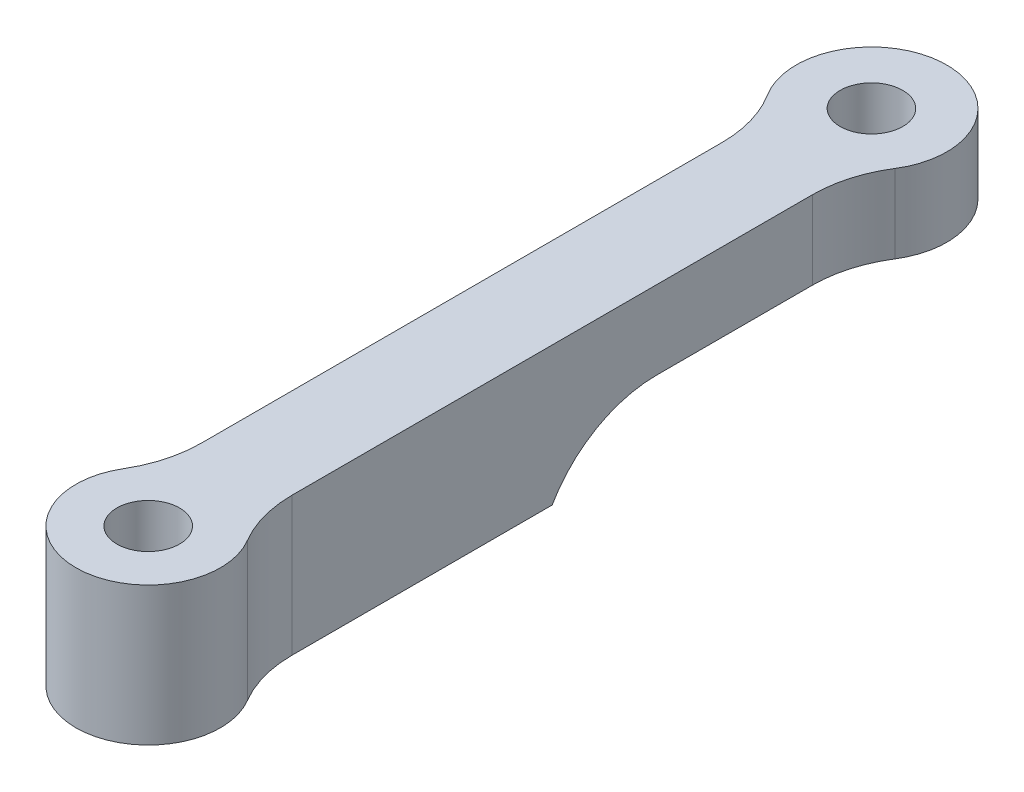
ISO-10303-21;
HEADER;
FILE_DESCRIPTION(('STEP AP214'),'2;1');
FILE_NAME('part.step','',(''),(''),'','','');
FILE_SCHEMA(('AUTOMOTIVE_DESIGN { 1 0 10303 214 1 1 1 1 }'));
ENDSEC;
DATA;
#1=APPLICATION_CONTEXT('core data for automotive mechanical design processes');
#2=APPLICATION_PROTOCOL_DEFINITION('international standard','automotive_design',2000,#1);
#3=PRODUCT_CONTEXT('',#1,'mechanical');
#4=PRODUCT('Part','Part','',(#3));
#5=PRODUCT_RELATED_PRODUCT_CATEGORY('part','',(#4));
#6=PRODUCT_DEFINITION_FORMATION('','',#4);
#7=PRODUCT_DEFINITION_CONTEXT('part definition',#1,'design');
#8=PRODUCT_DEFINITION('design','',#6,#7);
#9=PRODUCT_DEFINITION_SHAPE('','',#8);
#10=(LENGTH_UNIT() NAMED_UNIT(*) SI_UNIT(.MILLI.,.METRE.));
#11=(NAMED_UNIT(*) PLANE_ANGLE_UNIT() SI_UNIT($,.RADIAN.));
#12=(NAMED_UNIT(*) SI_UNIT($,.STERADIAN.) SOLID_ANGLE_UNIT());
#13=UNCERTAINTY_MEASURE_WITH_UNIT(LENGTH_MEASURE(1.E-05),#10,'distance_accuracy_value','');
#14=(GEOMETRIC_REPRESENTATION_CONTEXT(3) GLOBAL_UNCERTAINTY_ASSIGNED_CONTEXT((#13)) GLOBAL_UNIT_ASSIGNED_CONTEXT((#10,
#11,#12)) REPRESENTATION_CONTEXT('',''));
#15=CARTESIAN_POINT('',(0.,0.,0.));
#16=DIRECTION('',(0.,0.,1.));
#17=DIRECTION('',(1.,0.,0.));
#18=AXIS2_PLACEMENT_3D('',#15,#16,#17);
#19=CARTESIAN_POINT('',(0.,11.5,-60.));
#20=DIRECTION('',(0.,-1.,0.));
#21=DIRECTION('',(0.,0.,-1.));
#22=AXIS2_PLACEMENT_3D('',#19,#20,#21);
#23=CYLINDRICAL_SURFACE('',#22,2.6);
#24=CARTESIAN_POINT('',(0.,11.5,-60.));
#25=DIRECTION('',(0.,1.,0.));
#26=DIRECTION('',(0.,0.,1.));
#27=AXIS2_PLACEMENT_3D('',#24,#25,#26);
#28=CIRCLE('',#27,2.6);
#29=CARTESIAN_POINT('',(0.,11.5,-57.4));
#30=VERTEX_POINT('',#29);
#31=EDGE_CURVE('E194',#30,#30,#28,.T.);
#32=ORIENTED_EDGE('',*,*,#31,.T.);
#33=EDGE_LOOP('',(#32));
#34=FACE_BOUND('',#33,.T.);
#35=CARTESIAN_POINT('',(0.,5.,-60.));
#36=DIRECTION('',(0.,-1.,0.));
#37=DIRECTION('',(0.,0.,-1.));
#38=AXIS2_PLACEMENT_3D('',#35,#36,#37);
#39=CIRCLE('',#38,2.6);
#40=CARTESIAN_POINT('',(0.,5.,-62.6));
#41=VERTEX_POINT('',#40);
#42=EDGE_CURVE('E197',#41,#41,#39,.T.);
#43=ORIENTED_EDGE('',*,*,#42,.T.);
#44=EDGE_LOOP('',(#43));
#45=FACE_BOUND('',#44,.T.);
#46=ADVANCED_FACE('F60',(#34,#45),#23,.F.);
#47=CARTESIAN_POINT('',(0.,11.5,-60.));
#48=DIRECTION('',(0.,-1.,0.));
#49=DIRECTION('',(0.,0.,-1.));
#50=AXIS2_PLACEMENT_3D('',#47,#48,#49);
#51=CYLINDRICAL_SURFACE('',#50,6.25);
#52=DIRECTION('',(0.,-1.,0.));
#53=VECTOR('',#52,1.);
#54=CARTESIAN_POINT('',(5.28846153846154,11.5,-56.6691330623675));
#55=LINE('',#54,#53);
#56=CARTESIAN_POINT('',(5.28846153846154,11.5,-56.6691330623675));
#57=VERTEX_POINT('',#56);
#58=CARTESIAN_POINT('',(5.28846153846154,5.,-56.6691330623675));
#59=VERTEX_POINT('',#58);
#60=EDGE_CURVE('E177',#57,#59,#55,.T.);
#61=ORIENTED_EDGE('',*,*,#60,.T.);
#62=CARTESIAN_POINT('',(0.,5.,-60.));
#63=DIRECTION('',(0.,-1.,0.));
#64=DIRECTION('',(0.,0.,-1.));
#65=AXIS2_PLACEMENT_3D('',#62,#63,#64);
#66=CIRCLE('',#65,6.25);
#67=CARTESIAN_POINT('',(-5.28846153846154,5.,-56.6691330623675));
#68=VERTEX_POINT('',#67);
#69=EDGE_CURVE('E219',#68,#59,#66,.T.);
#70=ORIENTED_EDGE('',*,*,#69,.F.);
#71=DIRECTION('',(0.,-1.,0.));
#72=VECTOR('',#71,1.);
#73=CARTESIAN_POINT('',(-5.28846153846154,11.5,-56.6691330623675));
#74=LINE('',#73,#72);
#75=CARTESIAN_POINT('',(-5.28846153846154,11.5,-56.6691330623675));
#76=VERTEX_POINT('',#75);
#77=EDGE_CURVE('E175',#68,#76,#74,.F.);
#78=ORIENTED_EDGE('',*,*,#77,.T.);
#79=CARTESIAN_POINT('',(0.,11.5,-60.));
#80=DIRECTION('',(0.,1.,0.));
#81=DIRECTION('',(0.,0.,1.));
#82=AXIS2_PLACEMENT_3D('',#79,#80,#81);
#83=CIRCLE('',#82,6.25);
#84=EDGE_CURVE('E191',#57,#76,#83,.T.);
#85=ORIENTED_EDGE('',*,*,#84,.F.);
#86=EDGE_LOOP('',(#61,#70,#78,#85));
#87=FACE_BOUND('',#86,.T.);
#88=ADVANCED_FACE('F233',(#87),#51,.T.);
#89=CARTESIAN_POINT('',(-13.75,11.5,-51.3397459621556));
#90=DIRECTION('',(0.,-1.,0.));
#91=DIRECTION('',(0.,0.,-1.));
#92=AXIS2_PLACEMENT_3D('',#89,#90,#91);
#93=CYLINDRICAL_SURFACE('',#92,10.);
#94=CARTESIAN_POINT('',(-13.75,5.,-51.3397459621556));
#95=DIRECTION('',(0.,-1.,0.));
#96=DIRECTION('',(0.,0.,-1.));
#97=AXIS2_PLACEMENT_3D('',#94,#95,#96);
#98=CIRCLE('',#97,10.);
#99=CARTESIAN_POINT('',(-3.75,5.,-51.3397459621556));
#100=VERTEX_POINT('',#99);
#101=EDGE_CURVE('E217',#100,#68,#98,.F.);
#102=ORIENTED_EDGE('',*,*,#101,.F.);
#103=DIRECTION('',(0.,1.,0.));
#104=VECTOR('',#103,1.);
#105=CARTESIAN_POINT('',(-3.75,0.,-51.3397459621556));
#106=LINE('',#105,#104);
#107=CARTESIAN_POINT('',(-3.75,11.5,-51.3397459621556));
#108=VERTEX_POINT('',#107);
#109=EDGE_CURVE('E182',#108,#100,#106,.F.);
#110=ORIENTED_EDGE('',*,*,#109,.F.);
#111=CARTESIAN_POINT('',(-13.75,11.5,-51.3397459621556));
#112=DIRECTION('',(0.,1.,0.));
#113=DIRECTION('',(0.,0.,1.));
#114=AXIS2_PLACEMENT_3D('',#111,#112,#113);
#115=CIRCLE('',#114,10.);
#116=EDGE_CURVE('E166',#76,#108,#115,.F.);
#117=ORIENTED_EDGE('',*,*,#116,.F.);
#118=ORIENTED_EDGE('',*,*,#77,.F.);
#119=EDGE_LOOP('',(#102,#110,#117,#118));
#120=FACE_BOUND('',#119,.T.);
#121=ADVANCED_FACE('F242',(#120),#93,.F.);
#122=CARTESIAN_POINT('',(13.75,11.5,-51.3397459621556));
#123=DIRECTION('',(0.,-1.,0.));
#124=DIRECTION('',(0.,0.,-1.));
#125=AXIS2_PLACEMENT_3D('',#122,#123,#124);
#126=CYLINDRICAL_SURFACE('',#125,10.);
#127=CARTESIAN_POINT('',(13.75,5.,-51.3397459621556));
#128=DIRECTION('',(0.,-1.,0.));
#129=DIRECTION('',(0.,0.,-1.));
#130=AXIS2_PLACEMENT_3D('',#127,#128,#129);
#131=CIRCLE('',#130,10.);
#132=CARTESIAN_POINT('',(3.75,5.,-51.3397459621556));
#133=VERTEX_POINT('',#132);
#134=EDGE_CURVE('E155',#59,#133,#131,.F.);
#135=ORIENTED_EDGE('',*,*,#134,.F.);
#136=ORIENTED_EDGE('',*,*,#60,.F.);
#137=CARTESIAN_POINT('',(13.75,11.5,-51.3397459621556));
#138=DIRECTION('',(0.,1.,0.));
#139=DIRECTION('',(0.,0.,1.));
#140=AXIS2_PLACEMENT_3D('',#137,#138,#139);
#141=CIRCLE('',#140,10.);
#142=CARTESIAN_POINT('',(3.75,11.5,-51.3397459621556));
#143=VERTEX_POINT('',#142);
#144=EDGE_CURVE('E158',#143,#57,#141,.F.);
#145=ORIENTED_EDGE('',*,*,#144,.F.);
#146=DIRECTION('',(0.,-1.,0.));
#147=VECTOR('',#146,1.);
#148=CARTESIAN_POINT('',(3.75,11.5,-51.3397459621556));
#149=LINE('',#148,#147);
#150=EDGE_CURVE('E173',#133,#143,#149,.F.);
#151=ORIENTED_EDGE('',*,*,#150,.F.);
#152=EDGE_LOOP('',(#135,#136,#145,#151));
#153=FACE_BOUND('',#152,.T.);
#154=ADVANCED_FACE('F230',(#153),#126,.F.);
#155=CARTESIAN_POINT('',(3.75000000000001,11.5,0.));
#156=DIRECTION('',(1.,0.,0.));
#157=DIRECTION('',(0.,0.,-1.));
#158=AXIS2_PLACEMENT_3D('',#155,#156,#157);
#159=PLANE('',#158);
#160=DIRECTION('',(0.,0.,1.));
#161=VECTOR('',#160,1.);
#162=CARTESIAN_POINT('',(3.75000000000001,0.,0.));
#163=LINE('',#162,#161);
#164=CARTESIAN_POINT('',(3.75,0.,-29.7606400240662));
#165=VERTEX_POINT('',#164);
#166=CARTESIAN_POINT('',(3.75000000000001,0.,-8.18153408597677));
#167=VERTEX_POINT('',#166);
#168=EDGE_CURVE('E138',#165,#167,#163,.T.);
#169=ORIENTED_EDGE('',*,*,#168,.F.);
#170=CARTESIAN_POINT('',(3.75,-5.,-38.4208940619106));
#171=DIRECTION('',(1.,0.,0.));
#172=DIRECTION('',(0.,0.,-1.));
#173=AXIS2_PLACEMENT_3D('',#170,#171,#172);
#174=CIRCLE('',#173,10.);
#175=CARTESIAN_POINT('',(3.75,5.,-38.4208940619106));
#176=VERTEX_POINT('',#175);
#177=EDGE_CURVE('E12',#165,#176,#174,.F.);
#178=ORIENTED_EDGE('',*,*,#177,.T.);
#179=DIRECTION('',(0.,0.,-1.));
#180=VECTOR('',#179,1.);
#181=CARTESIAN_POINT('',(3.75000000000001,5.,0.));
#182=LINE('',#181,#180);
#183=EDGE_CURVE('E142',#176,#133,#182,.T.);
#184=ORIENTED_EDGE('',*,*,#183,.T.);
#185=ORIENTED_EDGE('',*,*,#150,.T.);
#186=DIRECTION('',(0.,0.,1.));
#187=VECTOR('',#186,1.);
#188=CARTESIAN_POINT('',(3.75000000000001,11.5,0.));
#189=LINE('',#188,#187);
#190=CARTESIAN_POINT('',(3.75000000000001,11.5,-8.18153408597677));
#191=VERTEX_POINT('',#190);
#192=EDGE_CURVE('E206',#143,#191,#189,.T.);
#193=ORIENTED_EDGE('',*,*,#192,.T.);
#194=DIRECTION('',(0.,-1.,0.));
#195=VECTOR('',#194,1.);
#196=CARTESIAN_POINT('',(3.75000000000001,11.5,-8.18153408597677));
#197=LINE('',#196,#195);
#198=EDGE_CURVE('E148',#191,#167,#197,.T.);
#199=ORIENTED_EDGE('',*,*,#198,.T.);
#200=EDGE_LOOP('',(#169,#178,#184,#185,#193,#199));
#201=FACE_BOUND('',#200,.T.);
#202=ADVANCED_FACE('F145',(#201),#159,.T.);
#203=CARTESIAN_POINT('',(-3.75000000000001,11.5,0.));
#204=DIRECTION('',(1.,0.,0.));
#205=DIRECTION('',(0.,0.,-1.));
#206=AXIS2_PLACEMENT_3D('',#203,#204,#205);
#207=PLANE('',#206);
#208=DIRECTION('',(0.,0.,-1.));
#209=VECTOR('',#208,1.);
#210=CARTESIAN_POINT('',(-3.75000000000001,5.,0.));
#211=LINE('',#210,#209);
#212=CARTESIAN_POINT('',(-3.75,5.,-38.4208940619106));
#213=VERTEX_POINT('',#212);
#214=EDGE_CURVE('E215',#213,#100,#211,.T.);
#215=ORIENTED_EDGE('',*,*,#214,.F.);
#216=CARTESIAN_POINT('',(-3.75,-5.,-38.4208940619106));
#217=DIRECTION('',(1.,0.,0.));
#218=DIRECTION('',(0.,0.,-1.));
#219=AXIS2_PLACEMENT_3D('',#216,#217,#218);
#220=CIRCLE('',#219,10.);
#221=CARTESIAN_POINT('',(-3.75,0.,-29.7606400240662));
#222=VERTEX_POINT('',#221);
#223=EDGE_CURVE('E68',#213,#222,#220,.T.);
#224=ORIENTED_EDGE('',*,*,#223,.T.);
#225=DIRECTION('',(0.,0.,1.));
#226=VECTOR('',#225,1.);
#227=CARTESIAN_POINT('',(-3.75000000000001,0.,0.));
#228=LINE('',#227,#226);
#229=CARTESIAN_POINT('',(-3.75000000000001,0.,-8.18153408597677));
#230=VERTEX_POINT('',#229);
#231=EDGE_CURVE('E141',#222,#230,#228,.T.);
#232=ORIENTED_EDGE('',*,*,#231,.T.);
#233=DIRECTION('',(0.,1.,0.));
#234=VECTOR('',#233,1.);
#235=CARTESIAN_POINT('',(-3.75,11.5,-8.18153408597677));
#236=LINE('',#235,#234);
#237=CARTESIAN_POINT('',(-3.75000000000001,11.5,-8.18153408597677));
#238=VERTEX_POINT('',#237);
#239=EDGE_CURVE('E180',#230,#238,#236,.T.);
#240=ORIENTED_EDGE('',*,*,#239,.T.);
#241=DIRECTION('',(0.,0.,1.));
#242=VECTOR('',#241,1.);
#243=CARTESIAN_POINT('',(-3.75000000000001,11.5,0.));
#244=LINE('',#243,#242);
#245=EDGE_CURVE('E199',#108,#238,#244,.T.);
#246=ORIENTED_EDGE('',*,*,#245,.F.);
#247=ORIENTED_EDGE('',*,*,#109,.T.);
#248=EDGE_LOOP('',(#215,#224,#232,#240,#246,#247));
#249=FACE_BOUND('',#248,.T.);
#250=ADVANCED_FACE('F244',(#249),#207,.F.);
#251=CARTESIAN_POINT('',(0.,11.5,0.));
#252=DIRECTION('',(0.,-1.,0.));
#253=DIRECTION('',(0.,0.,-1.));
#254=AXIS2_PLACEMENT_3D('',#251,#252,#253);
#255=CYLINDRICAL_SURFACE('',#254,2.6);
#256=CARTESIAN_POINT('',(0.,11.5,0.));
#257=DIRECTION('',(0.,1.,0.));
#258=DIRECTION('',(0.,0.,1.));
#259=AXIS2_PLACEMENT_3D('',#256,#257,#258);
#260=CIRCLE('',#259,2.6);
#261=CARTESIAN_POINT('',(0.,11.5,2.6));
#262=VERTEX_POINT('',#261);
#263=EDGE_CURVE('E190',#262,#262,#260,.T.);
#264=ORIENTED_EDGE('',*,*,#263,.T.);
#265=EDGE_LOOP('',(#264));
#266=FACE_BOUND('',#265,.T.);
#267=CARTESIAN_POINT('',(0.,0.,0.));
#268=DIRECTION('',(0.,1.,0.));
#269=DIRECTION('',(0.,0.,1.));
#270=AXIS2_PLACEMENT_3D('',#267,#268,#269);
#271=CIRCLE('',#270,2.6);
#272=CARTESIAN_POINT('',(0.,0.,2.6));
#273=VERTEX_POINT('',#272);
#274=EDGE_CURVE('E149',#273,#273,#271,.T.);
#275=ORIENTED_EDGE('',*,*,#274,.F.);
#276=EDGE_LOOP('',(#275));
#277=FACE_BOUND('',#276,.T.);
#278=ADVANCED_FACE('F281',(#266,#277),#255,.F.);
#279=CARTESIAN_POINT('',(0.,11.5,0.));
#280=DIRECTION('',(0.,-1.,0.));
#281=DIRECTION('',(0.,0.,-1.));
#282=AXIS2_PLACEMENT_3D('',#279,#280,#281);
#283=CYLINDRICAL_SURFACE('',#282,6.);
#284=CARTESIAN_POINT('',(0.,11.5,0.));
#285=DIRECTION('',(0.,1.,0.));
#286=DIRECTION('',(0.,0.,1.));
#287=AXIS2_PLACEMENT_3D('',#284,#285,#286);
#288=CIRCLE('',#287,6.);
#289=CARTESIAN_POINT('',(-5.15625,11.5,-3.06807528224129));
#290=VERTEX_POINT('',#289);
#291=CARTESIAN_POINT('',(5.15625,11.5,-3.06807528224129));
#292=VERTEX_POINT('',#291);
#293=EDGE_CURVE('E208',#290,#292,#288,.T.);
#294=ORIENTED_EDGE('',*,*,#293,.F.);
#295=DIRECTION('',(0.,-1.,0.));
#296=VECTOR('',#295,1.);
#297=CARTESIAN_POINT('',(-5.15625,11.5,-3.06807528224129));
#298=LINE('',#297,#296);
#299=CARTESIAN_POINT('',(-5.15625,0.,-3.06807528224129));
#300=VERTEX_POINT('',#299);
#301=EDGE_CURVE('E185',#290,#300,#298,.T.);
#302=ORIENTED_EDGE('',*,*,#301,.T.);
#303=CARTESIAN_POINT('',(0.,0.,0.));
#304=DIRECTION('',(0.,1.,0.));
#305=DIRECTION('',(0.,0.,1.));
#306=AXIS2_PLACEMENT_3D('',#303,#304,#305);
#307=CIRCLE('',#306,6.);
#308=CARTESIAN_POINT('',(5.15625,0.,-3.06807528224129));
#309=VERTEX_POINT('',#308);
#310=EDGE_CURVE('E150',#300,#309,#307,.T.);
#311=ORIENTED_EDGE('',*,*,#310,.T.);
#312=DIRECTION('',(0.,-1.,0.));
#313=VECTOR('',#312,1.);
#314=CARTESIAN_POINT('',(5.15625,11.5,-3.06807528224129));
#315=LINE('',#314,#313);
#316=EDGE_CURVE('E188',#309,#292,#315,.F.);
#317=ORIENTED_EDGE('',*,*,#316,.T.);
#318=EDGE_LOOP('',(#294,#302,#311,#317));
#319=FACE_BOUND('',#318,.T.);
#320=ADVANCED_FACE('F253',(#319),#283,.T.);
#321=CARTESIAN_POINT('',(0.,0.,0.));
#322=DIRECTION('',(0.,1.,0.));
#323=DIRECTION('',(0.,0.,1.));
#324=AXIS2_PLACEMENT_3D('',#321,#322,#323);
#325=PLANE('',#324);
#326=ORIENTED_EDGE('',*,*,#231,.F.);
#327=DIRECTION('',(-1.,0.,0.));
#328=VECTOR('',#327,1.);
#329=CARTESIAN_POINT('',(6.25,0.,-29.7606400240662));
#330=LINE('',#329,#328);
#331=EDGE_CURVE('E135',#165,#222,#330,.T.);
#332=ORIENTED_EDGE('',*,*,#331,.F.);
#333=ORIENTED_EDGE('',*,*,#168,.T.);
#334=CARTESIAN_POINT('',(13.75,0.,-8.18153408597678));
#335=DIRECTION('',(0.,1.,0.));
#336=DIRECTION('',(0.,0.,1.));
#337=AXIS2_PLACEMENT_3D('',#334,#335,#336);
#338=CIRCLE('',#337,10.);
#339=EDGE_CURVE('E164',#167,#309,#338,.T.);
#340=ORIENTED_EDGE('',*,*,#339,.T.);
#341=ORIENTED_EDGE('',*,*,#310,.F.);
#342=CARTESIAN_POINT('',(-13.75,0.,-8.18153408597678));
#343=DIRECTION('',(0.,1.,0.));
#344=DIRECTION('',(0.,0.,1.));
#345=AXIS2_PLACEMENT_3D('',#342,#343,#344);
#346=CIRCLE('',#345,10.);
#347=EDGE_CURVE('E170',#300,#230,#346,.T.);
#348=ORIENTED_EDGE('',*,*,#347,.T.);
#349=EDGE_LOOP('',(#326,#332,#333,#340,#341,#348));
#350=FACE_BOUND('',#349,.T.);
#351=ORIENTED_EDGE('',*,*,#274,.T.);
#352=EDGE_LOOP('',(#351));
#353=FACE_BOUND('',#352,.T.);
#354=ADVANCED_FACE('F136',(#350,#353),#325,.F.);
#355=CARTESIAN_POINT('',(0.,11.5,0.));
#356=DIRECTION('',(0.,1.,0.));
#357=DIRECTION('',(0.,0.,1.));
#358=AXIS2_PLACEMENT_3D('',#355,#356,#357);
#359=PLANE('',#358);
#360=ORIENTED_EDGE('',*,*,#245,.T.);
#361=CARTESIAN_POINT('',(-13.75,11.5,-8.18153408597678));
#362=DIRECTION('',(0.,1.,0.));
#363=DIRECTION('',(0.,0.,1.));
#364=AXIS2_PLACEMENT_3D('',#361,#362,#363);
#365=CIRCLE('',#364,10.);
#366=EDGE_CURVE('E168',#238,#290,#365,.F.);
#367=ORIENTED_EDGE('',*,*,#366,.T.);
#368=ORIENTED_EDGE('',*,*,#293,.T.);
#369=CARTESIAN_POINT('',(13.75,11.5,-8.18153408597678));
#370=DIRECTION('',(0.,1.,0.));
#371=DIRECTION('',(0.,0.,1.));
#372=AXIS2_PLACEMENT_3D('',#369,#370,#371);
#373=CIRCLE('',#372,10.);
#374=EDGE_CURVE('E162',#292,#191,#373,.F.);
#375=ORIENTED_EDGE('',*,*,#374,.T.);
#376=ORIENTED_EDGE('',*,*,#192,.F.);
#377=ORIENTED_EDGE('',*,*,#144,.T.);
#378=ORIENTED_EDGE('',*,*,#84,.T.);
#379=ORIENTED_EDGE('',*,*,#116,.T.);
#380=EDGE_LOOP('',(#360,#367,#368,#375,#376,#377,#378,#379));
#381=FACE_BOUND('',#380,.T.);
#382=ORIENTED_EDGE('',*,*,#263,.F.);
#383=EDGE_LOOP('',(#382));
#384=FACE_BOUND('',#383,.T.);
#385=ORIENTED_EDGE('',*,*,#31,.F.);
#386=EDGE_LOOP('',(#385));
#387=FACE_BOUND('',#386,.T.);
#388=ADVANCED_FACE('F236',(#381,#384,#387),#359,.T.);
#389=CARTESIAN_POINT('',(-13.75,11.5,-8.18153408597678));
#390=DIRECTION('',(0.,-1.,0.));
#391=DIRECTION('',(0.,0.,-1.));
#392=AXIS2_PLACEMENT_3D('',#389,#390,#391);
#393=CYLINDRICAL_SURFACE('',#392,10.);
#394=ORIENTED_EDGE('',*,*,#366,.F.);
#395=ORIENTED_EDGE('',*,*,#239,.F.);
#396=ORIENTED_EDGE('',*,*,#347,.F.);
#397=ORIENTED_EDGE('',*,*,#301,.F.);
#398=EDGE_LOOP('',(#394,#395,#396,#397));
#399=FACE_BOUND('',#398,.T.);
#400=ADVANCED_FACE('F250',(#399),#393,.F.);
#401=CARTESIAN_POINT('',(13.75,11.5,-8.18153408597678));
#402=DIRECTION('',(0.,-1.,0.));
#403=DIRECTION('',(0.,0.,-1.));
#404=AXIS2_PLACEMENT_3D('',#401,#402,#403);
#405=CYLINDRICAL_SURFACE('',#404,10.);
#406=ORIENTED_EDGE('',*,*,#374,.F.);
#407=ORIENTED_EDGE('',*,*,#316,.F.);
#408=ORIENTED_EDGE('',*,*,#339,.F.);
#409=ORIENTED_EDGE('',*,*,#198,.F.);
#410=EDGE_LOOP('',(#406,#407,#408,#409));
#411=FACE_BOUND('',#410,.T.);
#412=ADVANCED_FACE('F257',(#411),#405,.F.);
#413=CARTESIAN_POINT('',(0.,5.,0.));
#414=DIRECTION('',(0.,-1.,0.));
#415=DIRECTION('',(0.,0.,-1.));
#416=AXIS2_PLACEMENT_3D('',#413,#414,#415);
#417=PLANE('',#416);
#418=ORIENTED_EDGE('',*,*,#42,.F.);
#419=EDGE_LOOP('',(#418));
#420=FACE_BOUND('',#419,.T.);
#421=ORIENTED_EDGE('',*,*,#183,.F.);
#422=DIRECTION('',(1.,0.,0.));
#423=VECTOR('',#422,1.);
#424=CARTESIAN_POINT('',(-3.75,5.,-38.4208940619106));
#425=LINE('',#424,#423);
#426=EDGE_CURVE('E152',#176,#213,#425,.F.);
#427=ORIENTED_EDGE('',*,*,#426,.T.);
#428=ORIENTED_EDGE('',*,*,#214,.T.);
#429=ORIENTED_EDGE('',*,*,#101,.T.);
#430=ORIENTED_EDGE('',*,*,#69,.T.);
#431=ORIENTED_EDGE('',*,*,#134,.T.);
#432=EDGE_LOOP('',(#421,#427,#428,#429,#430,#431));
#433=FACE_BOUND('',#432,.T.);
#434=ADVANCED_FACE('F223',(#420,#433),#417,.T.);
#435=CARTESIAN_POINT('',(6.25,-5.,-38.4208940619106));
#436=DIRECTION('',(-1.,0.,0.));
#437=DIRECTION('',(0.,0.,1.));
#438=AXIS2_PLACEMENT_3D('',#435,#436,#437);
#439=CYLINDRICAL_SURFACE('',#438,10.);
#440=ORIENTED_EDGE('',*,*,#177,.F.);
#441=ORIENTED_EDGE('',*,*,#331,.T.);
#442=ORIENTED_EDGE('',*,*,#223,.F.);
#443=ORIENTED_EDGE('',*,*,#426,.F.);
#444=EDGE_LOOP('',(#440,#441,#442,#443));
#445=FACE_BOUND('',#444,.T.);
#446=ADVANCED_FACE('F62',(#445),#439,.F.);
#447=CLOSED_SHELL('',(#46,#88,#121,#154,#202,#250,#278,#320,#354,#388,#400,#412,#434,#446));
#448=MANIFOLD_SOLID_BREP('B2',#447);
#449=ADVANCED_BREP_SHAPE_REPRESENTATION('',(#18,#448),#14);
#450=SHAPE_DEFINITION_REPRESENTATION(#9,#449);
ENDSEC;
END-ISO-10303-21;
